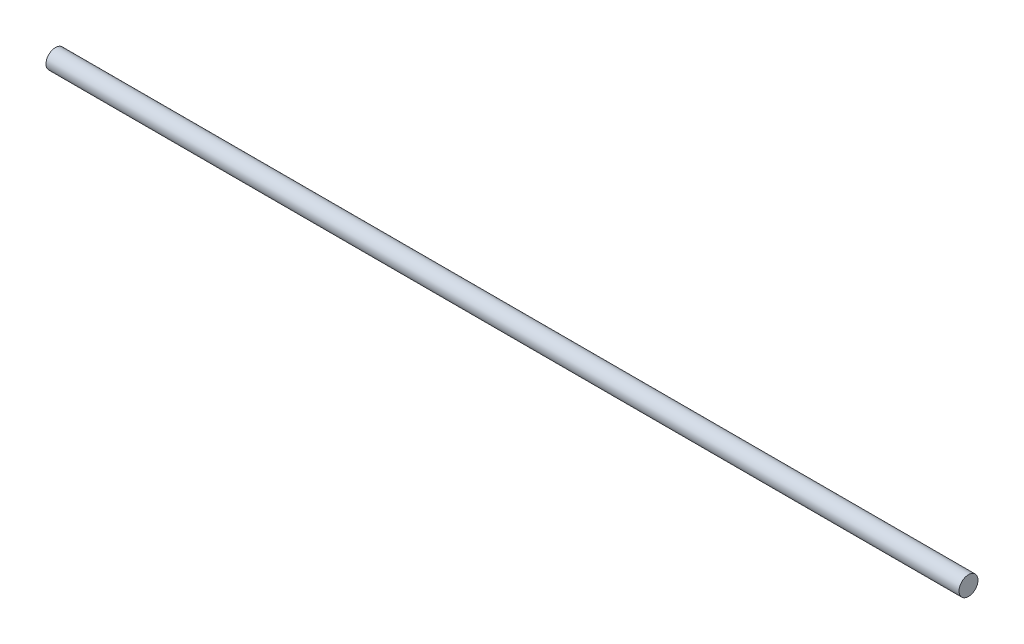
ISO-10303-21;
HEADER;
FILE_DESCRIPTION(('STEP AP214'),'2;1');
FILE_NAME('part.step','',(''),(''),'','','');
FILE_SCHEMA(('AUTOMOTIVE_DESIGN { 1 0 10303 214 1 1 1 1 }'));
ENDSEC;
DATA;
#1=APPLICATION_CONTEXT('core data for automotive mechanical design processes');
#2=APPLICATION_PROTOCOL_DEFINITION('international standard','automotive_design',2000,#1);
#3=PRODUCT_CONTEXT('',#1,'mechanical');
#4=PRODUCT('Part','Part','',(#3));
#5=PRODUCT_RELATED_PRODUCT_CATEGORY('part','',(#4));
#6=PRODUCT_DEFINITION_FORMATION('','',#4);
#7=PRODUCT_DEFINITION_CONTEXT('part definition',#1,'design');
#8=PRODUCT_DEFINITION('design','',#6,#7);
#9=PRODUCT_DEFINITION_SHAPE('','',#8);
#10=(LENGTH_UNIT() NAMED_UNIT(*) SI_UNIT(.MILLI.,.METRE.));
#11=(NAMED_UNIT(*) PLANE_ANGLE_UNIT() SI_UNIT($,.RADIAN.));
#12=(NAMED_UNIT(*) SI_UNIT($,.STERADIAN.) SOLID_ANGLE_UNIT());
#13=UNCERTAINTY_MEASURE_WITH_UNIT(LENGTH_MEASURE(1.E-05),#10,'distance_accuracy_value','');
#14=(GEOMETRIC_REPRESENTATION_CONTEXT(3) GLOBAL_UNCERTAINTY_ASSIGNED_CONTEXT((#13)) GLOBAL_UNIT_ASSIGNED_CONTEXT((#10,
#11,#12)) REPRESENTATION_CONTEXT('',''));
#15=CARTESIAN_POINT('',(0.,0.,0.));
#16=DIRECTION('',(0.,0.,1.));
#17=DIRECTION('',(1.,0.,0.));
#18=AXIS2_PLACEMENT_3D('',#15,#16,#17);
#19=CARTESIAN_POINT('',(385.,0.,0.));
#20=DIRECTION('',(-1.,0.,0.));
#21=DIRECTION('',(0.,0.,1.));
#22=AXIS2_PLACEMENT_3D('',#19,#20,#21);
#23=CYLINDRICAL_SURFACE('',#22,4.);
#24=CARTESIAN_POINT('',(385.,0.,0.));
#25=DIRECTION('',(1.,0.,0.));
#26=DIRECTION('',(0.,0.,-1.));
#27=AXIS2_PLACEMENT_3D('',#24,#25,#26);
#28=CIRCLE('',#27,4.);
#29=CARTESIAN_POINT('',(385.,0.,-4.));
#30=VERTEX_POINT('',#29);
#31=EDGE_CURVE('E10',#30,#30,#28,.T.);
#32=ORIENTED_EDGE('',*,*,#31,.F.);
#33=EDGE_LOOP('',(#32));
#34=FACE_BOUND('',#33,.T.);
#35=CARTESIAN_POINT('',(0.,0.,0.));
#36=DIRECTION('',(1.,0.,0.));
#37=DIRECTION('',(0.,0.,-1.));
#38=AXIS2_PLACEMENT_3D('',#35,#36,#37);
#39=CIRCLE('',#38,4.);
#40=CARTESIAN_POINT('',(0.,0.,-4.));
#41=VERTEX_POINT('',#40);
#42=EDGE_CURVE('E40',#41,#41,#39,.T.);
#43=ORIENTED_EDGE('',*,*,#42,.T.);
#44=EDGE_LOOP('',(#43));
#45=FACE_BOUND('',#44,.T.);
#46=ADVANCED_FACE('F37',(#34,#45),#23,.T.);
#47=CARTESIAN_POINT('',(385.,0.,0.));
#48=DIRECTION('',(1.,0.,0.));
#49=DIRECTION('',(0.,0.,-1.));
#50=AXIS2_PLACEMENT_3D('',#47,#48,#49);
#51=PLANE('',#50);
#52=ORIENTED_EDGE('',*,*,#31,.T.);
#53=EDGE_LOOP('',(#52));
#54=FACE_BOUND('',#53,.T.);
#55=ADVANCED_FACE('F54',(#54),#51,.T.);
#56=CARTESIAN_POINT('',(0.,0.,0.));
#57=DIRECTION('',(1.,0.,0.));
#58=DIRECTION('',(0.,0.,-1.));
#59=AXIS2_PLACEMENT_3D('',#56,#57,#58);
#60=PLANE('',#59);
#61=ORIENTED_EDGE('',*,*,#42,.F.);
#62=EDGE_LOOP('',(#61));
#63=FACE_BOUND('',#62,.T.);
#64=ADVANCED_FACE('F52',(#63),#60,.F.);
#65=CLOSED_SHELL('',(#46,#55,#64));
#66=MANIFOLD_SOLID_BREP('B2',#65);
#67=ADVANCED_BREP_SHAPE_REPRESENTATION('',(#18,#66),#14);
#68=SHAPE_DEFINITION_REPRESENTATION(#9,#67);
ENDSEC;
END-ISO-10303-21;
